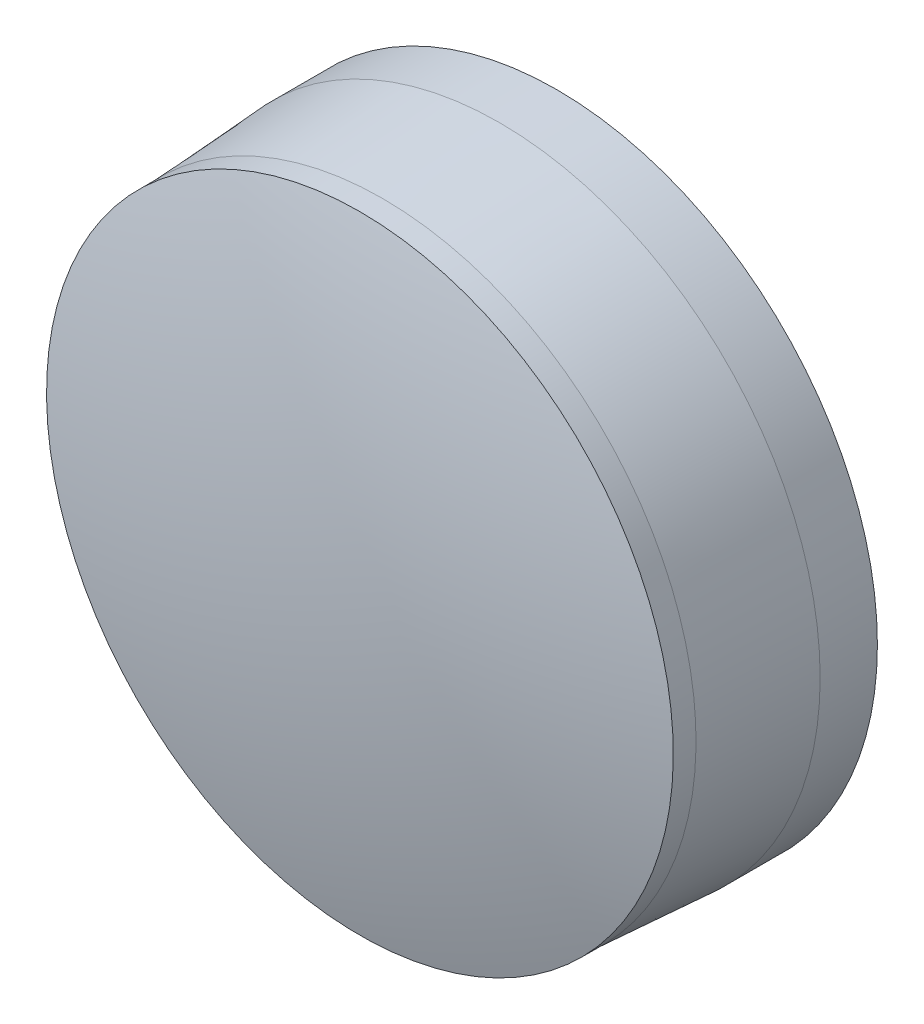
ISO-10303-21;
HEADER;
FILE_DESCRIPTION(('STEP AP214'),'2;1');
FILE_NAME('part.step','',(''),(''),'','','');
FILE_SCHEMA(('AUTOMOTIVE_DESIGN { 1 0 10303 214 1 1 1 1 }'));
ENDSEC;
DATA;
#1=APPLICATION_CONTEXT('core data for automotive mechanical design processes');
#2=APPLICATION_PROTOCOL_DEFINITION('international standard','automotive_design',2000,#1);
#3=PRODUCT_CONTEXT('',#1,'mechanical');
#4=PRODUCT('Part','Part','',(#3));
#5=PRODUCT_RELATED_PRODUCT_CATEGORY('part','',(#4));
#6=PRODUCT_DEFINITION_FORMATION('','',#4);
#7=PRODUCT_DEFINITION_CONTEXT('part definition',#1,'design');
#8=PRODUCT_DEFINITION('design','',#6,#7);
#9=PRODUCT_DEFINITION_SHAPE('','',#8);
#10=(LENGTH_UNIT() NAMED_UNIT(*) SI_UNIT(.MILLI.,.METRE.));
#11=(NAMED_UNIT(*) PLANE_ANGLE_UNIT() SI_UNIT($,.RADIAN.));
#12=(NAMED_UNIT(*) SI_UNIT($,.STERADIAN.) SOLID_ANGLE_UNIT());
#13=UNCERTAINTY_MEASURE_WITH_UNIT(LENGTH_MEASURE(1.E-05),#10,'distance_accuracy_value','');
#14=(GEOMETRIC_REPRESENTATION_CONTEXT(3) GLOBAL_UNCERTAINTY_ASSIGNED_CONTEXT((#13)) GLOBAL_UNIT_ASSIGNED_CONTEXT((#10,
#11,#12)) REPRESENTATION_CONTEXT('',''));
#15=CARTESIAN_POINT('',(0.,0.,0.));
#16=DIRECTION('',(0.,0.,1.));
#17=DIRECTION('',(1.,0.,0.));
#18=AXIS2_PLACEMENT_3D('',#15,#16,#17);
#19=CARTESIAN_POINT('',(0.,0.,-16.7481300000163));
#20=DIRECTION('',(0.,0.,-1.));
#21=DIRECTION('',(0.,1.,0.));
#22=AXIS2_PLACEMENT_3D('',#19,#20,#21);
#23=SPHERICAL_SURFACE('',#22,21.2481298700295);
#24=CARTESIAN_POINT('',(0.,0.,3.78251533746981));
#25=DIRECTION('',(0.,0.,-1.));
#26=DIRECTION('',(0.,1.,0.));
#27=AXIS2_PLACEMENT_3D('',#24,#25,#26);
#28=CIRCLE('',#27,5.475);
#29=CARTESIAN_POINT('',(0.,5.475,3.78251533746981));
#30=VERTEX_POINT('',#29);
#31=EDGE_CURVE('E46',#30,#30,#28,.T.);
#32=ORIENTED_EDGE('',*,*,#31,.F.);
#33=EDGE_LOOP('',(#32));
#34=FACE_BOUND('',#33,.T.);
#35=ADVANCED_FACE('F32',(#34),#23,.T.);
#36=CARTESIAN_POINT('',(0.,0.,46.10166));
#37=DIRECTION('',(0.,0.,-1.));
#38=DIRECTION('',(0.,-1.,0.));
#39=AXIS2_PLACEMENT_3D('',#36,#37,#38);
#40=SPHERICAL_SURFACE('',#39,46.10166);
#41=CARTESIAN_POINT('',(0.,0.,0.341381867589134));
#42=DIRECTION('',(0.,0.,-1.));
#43=DIRECTION('',(0.,1.,0.));
#44=AXIS2_PLACEMENT_3D('',#41,#42,#43);
#45=CIRCLE('',#44,5.6);
#46=CARTESIAN_POINT('',(0.,5.6,0.341381867589135));
#47=VERTEX_POINT('',#46);
#48=EDGE_CURVE('E10',#47,#47,#45,.T.);
#49=ORIENTED_EDGE('',*,*,#48,.T.);
#50=EDGE_LOOP('',(#49));
#51=FACE_BOUND('',#50,.T.);
#52=ADVANCED_FACE('F56',(#51),#40,.T.);
#53=CARTESIAN_POINT('',(0.,0.,-11.2667796808305));
#54=DIRECTION('',(0.,0.,-1.));
#55=DIRECTION('',(0.,1.,0.));
#56=AXIS2_PLACEMENT_3D('',#53,#54,#55);
#57=CYLINDRICAL_SURFACE('',#56,5.6);
#58=CARTESIAN_POINT('',(0.,0.,1.34138186758914));
#59=DIRECTION('',(0.,0.,-1.));
#60=DIRECTION('',(0.,1.,0.));
#61=AXIS2_PLACEMENT_3D('',#58,#59,#60);
#62=CIRCLE('',#61,5.6);
#63=CARTESIAN_POINT('',(0.,5.6,1.34138186758914));
#64=VERTEX_POINT('',#63);
#65=EDGE_CURVE('E38',#64,#64,#62,.T.);
#66=ORIENTED_EDGE('',*,*,#65,.T.);
#67=EDGE_LOOP('',(#66));
#68=FACE_BOUND('',#67,.T.);
#69=ORIENTED_EDGE('',*,*,#48,.F.);
#70=EDGE_LOOP('',(#69));
#71=FACE_BOUND('',#70,.T.);
#72=ADVANCED_FACE('F60',(#68,#71),#57,.T.);
#73=CARTESIAN_POINT('',(0.,0.,1.34138186758914));
#74=DIRECTION('',(0.,0.,-1.));
#75=DIRECTION('',(0.,1.,0.));
#76=AXIS2_PLACEMENT_3D('',#73,#74,#75);
#77=CONICAL_SURFACE('',#76,5.6,0.0610865238197951);
#78=CARTESIAN_POINT('',(0.,0.,3.3851138021018));
#79=DIRECTION('',(0.,0.,-1.));
#80=DIRECTION('',(0.,1.,0.));
#81=AXIS2_PLACEMENT_3D('',#78,#79,#80);
#82=CIRCLE('',#81,5.475);
#83=CARTESIAN_POINT('',(0.,5.475,3.3851138021018));
#84=VERTEX_POINT('',#83);
#85=EDGE_CURVE('E42',#84,#84,#82,.T.);
#86=ORIENTED_EDGE('',*,*,#85,.T.);
#87=EDGE_LOOP('',(#86));
#88=FACE_BOUND('',#87,.T.);
#89=ORIENTED_EDGE('',*,*,#65,.F.);
#90=EDGE_LOOP('',(#89));
#91=FACE_BOUND('',#90,.T.);
#92=ADVANCED_FACE('F64',(#88,#91),#77,.T.);
#93=CARTESIAN_POINT('',(0.,0.,-11.2667796808305));
#94=DIRECTION('',(0.,0.,-1.));
#95=DIRECTION('',(0.,1.,0.));
#96=AXIS2_PLACEMENT_3D('',#93,#94,#95);
#97=CYLINDRICAL_SURFACE('',#96,5.475);
#98=ORIENTED_EDGE('',*,*,#31,.T.);
#99=EDGE_LOOP('',(#98));
#100=FACE_BOUND('',#99,.T.);
#101=ORIENTED_EDGE('',*,*,#85,.F.);
#102=EDGE_LOOP('',(#101));
#103=FACE_BOUND('',#102,.T.);
#104=ADVANCED_FACE('F52',(#100,#103),#97,.T.);
#105=CLOSED_SHELL('',(#35,#52,#72,#92,#104));
#106=MANIFOLD_SOLID_BREP('B2',#105);
#107=ADVANCED_BREP_SHAPE_REPRESENTATION('',(#18,#106),#14);
#108=SHAPE_DEFINITION_REPRESENTATION(#9,#107);
ENDSEC;
END-ISO-10303-21;
